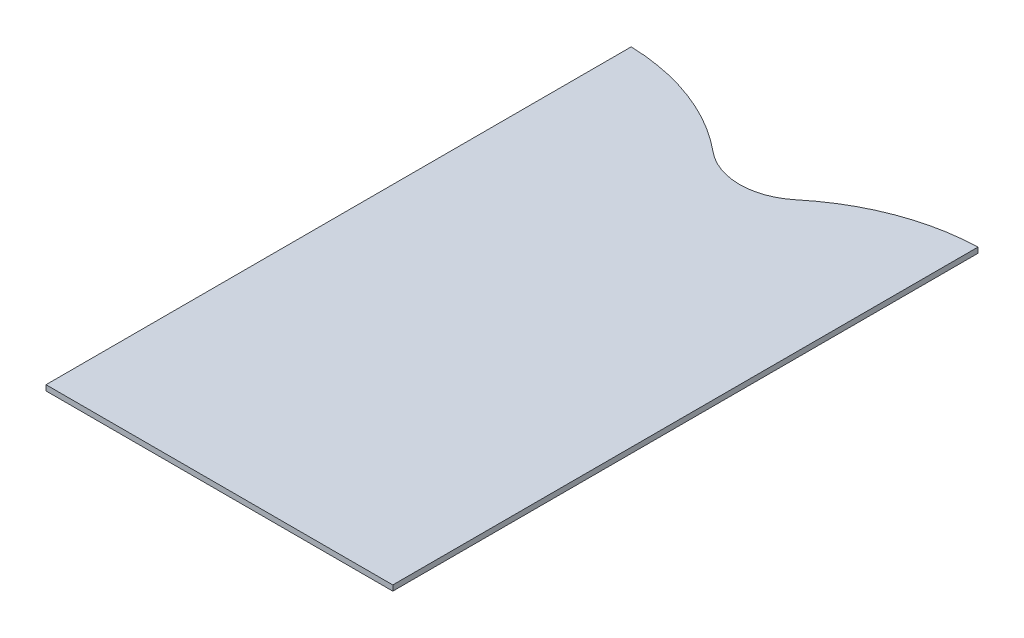
ISO-10303-21;
HEADER;
FILE_DESCRIPTION(('STEP AP214'),'2;1');
FILE_NAME('part.step','',(''),(''),'','','');
FILE_SCHEMA(('AUTOMOTIVE_DESIGN { 1 0 10303 214 1 1 1 1 }'));
ENDSEC;
DATA;
#1=APPLICATION_CONTEXT('core data for automotive mechanical design processes');
#2=APPLICATION_PROTOCOL_DEFINITION('international standard','automotive_design',2000,#1);
#3=PRODUCT_CONTEXT('',#1,'mechanical');
#4=PRODUCT('Part','Part','',(#3));
#5=PRODUCT_RELATED_PRODUCT_CATEGORY('part','',(#4));
#6=PRODUCT_DEFINITION_FORMATION('','',#4);
#7=PRODUCT_DEFINITION_CONTEXT('part definition',#1,'design');
#8=PRODUCT_DEFINITION('design','',#6,#7);
#9=PRODUCT_DEFINITION_SHAPE('','',#8);
#10=(LENGTH_UNIT() NAMED_UNIT(*) SI_UNIT(.MILLI.,.METRE.));
#11=(NAMED_UNIT(*) PLANE_ANGLE_UNIT() SI_UNIT($,.RADIAN.));
#12=(NAMED_UNIT(*) SI_UNIT($,.STERADIAN.) SOLID_ANGLE_UNIT());
#13=UNCERTAINTY_MEASURE_WITH_UNIT(LENGTH_MEASURE(1.E-05),#10,'distance_accuracy_value','');
#14=(GEOMETRIC_REPRESENTATION_CONTEXT(3) GLOBAL_UNCERTAINTY_ASSIGNED_CONTEXT((#13)) GLOBAL_UNIT_ASSIGNED_CONTEXT((#10,
#11,#12)) REPRESENTATION_CONTEXT('',''));
#15=CARTESIAN_POINT('',(0.,0.,0.));
#16=DIRECTION('',(0.,0.,1.));
#17=DIRECTION('',(1.,0.,0.));
#18=AXIS2_PLACEMENT_3D('',#15,#16,#17);
#19=CARTESIAN_POINT('',(101.6,3.175,-171.45));
#20=DIRECTION('',(-1.,0.,0.));
#21=DIRECTION('',(0.,0.,1.));
#22=AXIS2_PLACEMENT_3D('',#19,#20,#21);
#23=PLANE('',#22);
#24=DIRECTION('',(0.,0.,-1.));
#25=VECTOR('',#24,1.);
#26=CARTESIAN_POINT('',(101.6,0.,-171.45));
#27=LINE('',#26,#25);
#28=CARTESIAN_POINT('',(101.6,0.,171.45));
#29=VERTEX_POINT('',#28);
#30=CARTESIAN_POINT('',(101.6,0.,-171.45));
#31=VERTEX_POINT('',#30);
#32=EDGE_CURVE('E122',#29,#31,#27,.T.);
#33=ORIENTED_EDGE('',*,*,#32,.T.);
#34=DIRECTION('',(0.,-1.,0.));
#35=VECTOR('',#34,1.);
#36=CARTESIAN_POINT('',(101.6,3.175,-171.45));
#37=LINE('',#36,#35);
#38=CARTESIAN_POINT('',(101.6,3.175,-171.45));
#39=VERTEX_POINT('',#38);
#40=EDGE_CURVE('E101',#39,#31,#37,.T.);
#41=ORIENTED_EDGE('',*,*,#40,.F.);
#42=DIRECTION('',(0.,0.,-1.));
#43=VECTOR('',#42,1.);
#44=CARTESIAN_POINT('',(101.6,3.175,-171.45));
#45=LINE('',#44,#43);
#46=CARTESIAN_POINT('',(101.6,3.175,171.45));
#47=VERTEX_POINT('',#46);
#48=EDGE_CURVE('E109',#47,#39,#45,.T.);
#49=ORIENTED_EDGE('',*,*,#48,.F.);
#50=DIRECTION('',(0.,-1.,0.));
#51=VECTOR('',#50,1.);
#52=CARTESIAN_POINT('',(101.6,3.175,171.45));
#53=LINE('',#52,#51);
#54=EDGE_CURVE('E153',#47,#29,#53,.T.);
#55=ORIENTED_EDGE('',*,*,#54,.T.);
#56=EDGE_LOOP('',(#33,#41,#49,#55));
#57=FACE_BOUND('',#56,.T.);
#58=ADVANCED_FACE('F43',(#57),#23,.F.);
#59=CARTESIAN_POINT('',(-101.6,3.175,-171.45));
#60=DIRECTION('',(1.,0.,0.));
#61=DIRECTION('',(0.,0.,-1.));
#62=AXIS2_PLACEMENT_3D('',#59,#60,#61);
#63=PLANE('',#62);
#64=DIRECTION('',(0.,0.,1.));
#65=VECTOR('',#64,1.);
#66=CARTESIAN_POINT('',(-101.6,0.,-171.45));
#67=LINE('',#66,#65);
#68=CARTESIAN_POINT('',(-101.6,0.,-171.45));
#69=VERTEX_POINT('',#68);
#70=CARTESIAN_POINT('',(-101.6,0.,171.45));
#71=VERTEX_POINT('',#70);
#72=EDGE_CURVE('E156',#69,#71,#67,.T.);
#73=ORIENTED_EDGE('',*,*,#72,.T.);
#74=DIRECTION('',(0.,-1.,0.));
#75=VECTOR('',#74,1.);
#76=CARTESIAN_POINT('',(-101.6,3.175,171.45));
#77=LINE('',#76,#75);
#78=CARTESIAN_POINT('',(-101.6,3.175,171.45));
#79=VERTEX_POINT('',#78);
#80=EDGE_CURVE('E129',#79,#71,#77,.T.);
#81=ORIENTED_EDGE('',*,*,#80,.F.);
#82=DIRECTION('',(0.,0.,1.));
#83=VECTOR('',#82,1.);
#84=CARTESIAN_POINT('',(-101.6,3.175,-171.45));
#85=LINE('',#84,#83);
#86=CARTESIAN_POINT('',(-101.6,3.175,-171.45));
#87=VERTEX_POINT('',#86);
#88=EDGE_CURVE('E117',#87,#79,#85,.T.);
#89=ORIENTED_EDGE('',*,*,#88,.F.);
#90=DIRECTION('',(0.,-1.,0.));
#91=VECTOR('',#90,1.);
#92=CARTESIAN_POINT('',(-101.6,3.175,-171.45));
#93=LINE('',#92,#91);
#94=EDGE_CURVE('E124',#87,#69,#93,.T.);
#95=ORIENTED_EDGE('',*,*,#94,.T.);
#96=EDGE_LOOP('',(#73,#81,#89,#95));
#97=FACE_BOUND('',#96,.T.);
#98=ADVANCED_FACE('F171',(#97),#63,.F.);
#99=CARTESIAN_POINT('',(-101.6,3.175,171.45));
#100=DIRECTION('',(0.,0.,-1.));
#101=DIRECTION('',(-1.,0.,0.));
#102=AXIS2_PLACEMENT_3D('',#99,#100,#101);
#103=PLANE('',#102);
#104=DIRECTION('',(1.,0.,0.));
#105=VECTOR('',#104,1.);
#106=CARTESIAN_POINT('',(-101.6,0.,171.45));
#107=LINE('',#106,#105);
#108=EDGE_CURVE('E118',#71,#29,#107,.T.);
#109=ORIENTED_EDGE('',*,*,#108,.T.);
#110=ORIENTED_EDGE('',*,*,#54,.F.);
#111=DIRECTION('',(1.,0.,0.));
#112=VECTOR('',#111,1.);
#113=CARTESIAN_POINT('',(-101.6,3.175,171.45));
#114=LINE('',#113,#112);
#115=EDGE_CURVE('E112',#79,#47,#114,.T.);
#116=ORIENTED_EDGE('',*,*,#115,.F.);
#117=ORIENTED_EDGE('',*,*,#80,.T.);
#118=EDGE_LOOP('',(#109,#110,#116,#117));
#119=FACE_BOUND('',#118,.T.);
#120=ADVANCED_FACE('F167',(#119),#103,.F.);
#121=CARTESIAN_POINT('',(0.,3.175,0.));
#122=DIRECTION('',(0.,1.,0.));
#123=DIRECTION('',(0.,0.,1.));
#124=AXIS2_PLACEMENT_3D('',#121,#122,#123);
#125=PLANE('',#124);
#126=ORIENTED_EDGE('',*,*,#48,.T.);
#127=CARTESIAN_POINT('',(105.56875,3.175,-44.5120268657266));
#128=DIRECTION('',(0.,1.,0.));
#129=DIRECTION('',(0.,0.,1.));
#130=AXIS2_PLACEMENT_3D('',#127,#128,#129);
#131=CIRCLE('',#130,127.);
#132=CARTESIAN_POINT('',(24.3620192307692,3.175,-142.156621584398));
#133=VERTEX_POINT('',#132);
#134=EDGE_CURVE('E96',#39,#133,#131,.T.);
#135=ORIENTED_EDGE('',*,*,#134,.T.);
#136=CARTESIAN_POINT('',(0.,3.175,-171.45));
#137=DIRECTION('',(0.,1.,0.));
#138=DIRECTION('',(0.,0.,1.));
#139=AXIS2_PLACEMENT_3D('',#136,#137,#138);
#140=CIRCLE('',#139,38.1);
#141=CARTESIAN_POINT('',(-24.3620192307693,3.175,-142.156621584398));
#142=VERTEX_POINT('',#141);
#143=EDGE_CURVE('E140',#142,#133,#140,.T.);
#144=ORIENTED_EDGE('',*,*,#143,.F.);
#145=CARTESIAN_POINT('',(-105.56875,3.175,-44.5120268657267));
#146=DIRECTION('',(0.,1.,0.));
#147=DIRECTION('',(0.,0.,1.));
#148=AXIS2_PLACEMENT_3D('',#145,#146,#147);
#149=CIRCLE('',#148,127.);
#150=EDGE_CURVE('E106',#142,#87,#149,.T.);
#151=ORIENTED_EDGE('',*,*,#150,.T.);
#152=ORIENTED_EDGE('',*,*,#88,.T.);
#153=ORIENTED_EDGE('',*,*,#115,.T.);
#154=EDGE_LOOP('',(#126,#135,#144,#151,#152,#153));
#155=FACE_BOUND('',#154,.T.);
#156=ADVANCED_FACE('F110',(#155),#125,.T.);
#157=CARTESIAN_POINT('',(0.,0.,0.));
#158=DIRECTION('',(0.,1.,0.));
#159=DIRECTION('',(0.,0.,1.));
#160=AXIS2_PLACEMENT_3D('',#157,#158,#159);
#161=PLANE('',#160);
#162=CARTESIAN_POINT('',(0.,0.,-171.45));
#163=DIRECTION('',(0.,1.,0.));
#164=DIRECTION('',(0.,0.,1.));
#165=AXIS2_PLACEMENT_3D('',#162,#163,#164);
#166=CIRCLE('',#165,38.1);
#167=CARTESIAN_POINT('',(-24.3620192307693,0.,-142.156621584398));
#168=VERTEX_POINT('',#167);
#169=CARTESIAN_POINT('',(24.3620192307692,0.,-142.156621584398));
#170=VERTEX_POINT('',#169);
#171=EDGE_CURVE('E141',#168,#170,#166,.T.);
#172=ORIENTED_EDGE('',*,*,#171,.T.);
#173=CARTESIAN_POINT('',(105.56875,0.,-44.5120268657266));
#174=DIRECTION('',(0.,1.,0.));
#175=DIRECTION('',(0.,0.,1.));
#176=AXIS2_PLACEMENT_3D('',#173,#174,#175);
#177=CIRCLE('',#176,127.);
#178=EDGE_CURVE('E11',#170,#31,#177,.F.);
#179=ORIENTED_EDGE('',*,*,#178,.T.);
#180=ORIENTED_EDGE('',*,*,#32,.F.);
#181=ORIENTED_EDGE('',*,*,#108,.F.);
#182=ORIENTED_EDGE('',*,*,#72,.F.);
#183=CARTESIAN_POINT('',(-105.56875,0.,-44.5120268657267));
#184=DIRECTION('',(0.,1.,0.));
#185=DIRECTION('',(0.,0.,1.));
#186=AXIS2_PLACEMENT_3D('',#183,#184,#185);
#187=CIRCLE('',#186,127.);
#188=EDGE_CURVE('E52',#69,#168,#187,.F.);
#189=ORIENTED_EDGE('',*,*,#188,.T.);
#190=EDGE_LOOP('',(#172,#179,#180,#181,#182,#189));
#191=FACE_BOUND('',#190,.T.);
#192=ADVANCED_FACE('F169',(#191),#161,.F.);
#193=CARTESIAN_POINT('',(0.,0.,-171.45));
#194=DIRECTION('',(0.,1.,0.));
#195=DIRECTION('',(0.,0.,1.));
#196=AXIS2_PLACEMENT_3D('',#193,#194,#195);
#197=CYLINDRICAL_SURFACE('',#196,38.1);
#198=ORIENTED_EDGE('',*,*,#143,.T.);
#199=DIRECTION('',(0.,1.,0.));
#200=VECTOR('',#199,1.);
#201=CARTESIAN_POINT('',(24.3620192307692,0.,-142.156621584398));
#202=LINE('',#201,#200);
#203=EDGE_CURVE('E59',#133,#170,#202,.F.);
#204=ORIENTED_EDGE('',*,*,#203,.T.);
#205=ORIENTED_EDGE('',*,*,#171,.F.);
#206=DIRECTION('',(0.,1.,0.));
#207=VECTOR('',#206,1.);
#208=CARTESIAN_POINT('',(-24.3620192307693,0.,-142.156621584398));
#209=LINE('',#208,#207);
#210=EDGE_CURVE('E105',#168,#142,#209,.T.);
#211=ORIENTED_EDGE('',*,*,#210,.T.);
#212=EDGE_LOOP('',(#198,#204,#205,#211));
#213=FACE_BOUND('',#212,.T.);
#214=ADVANCED_FACE('F139',(#213),#197,.F.);
#215=CARTESIAN_POINT('',(105.56875,0.,-44.5120268657266));
#216=DIRECTION('',(0.,1.,0.));
#217=DIRECTION('',(0.,0.,1.));
#218=AXIS2_PLACEMENT_3D('',#215,#216,#217);
#219=CYLINDRICAL_SURFACE('',#218,127.);
#220=ORIENTED_EDGE('',*,*,#178,.F.);
#221=ORIENTED_EDGE('',*,*,#203,.F.);
#222=ORIENTED_EDGE('',*,*,#134,.F.);
#223=ORIENTED_EDGE('',*,*,#40,.T.);
#224=EDGE_LOOP('',(#220,#221,#222,#223));
#225=FACE_BOUND('',#224,.T.);
#226=ADVANCED_FACE('F99',(#225),#219,.T.);
#227=CARTESIAN_POINT('',(-105.56875,3.175,-44.5120268657267));
#228=DIRECTION('',(0.,1.,0.));
#229=DIRECTION('',(0.,0.,1.));
#230=AXIS2_PLACEMENT_3D('',#227,#228,#229);
#231=CYLINDRICAL_SURFACE('',#230,127.);
#232=ORIENTED_EDGE('',*,*,#188,.F.);
#233=ORIENTED_EDGE('',*,*,#94,.F.);
#234=ORIENTED_EDGE('',*,*,#150,.F.);
#235=ORIENTED_EDGE('',*,*,#210,.F.);
#236=EDGE_LOOP('',(#232,#233,#234,#235));
#237=FACE_BOUND('',#236,.T.);
#238=ADVANCED_FACE('F45',(#237),#231,.T.);
#239=CLOSED_SHELL('',(#58,#98,#120,#156,#192,#214,#226,#238));
#240=MANIFOLD_SOLID_BREP('B2',#239);
#241=ADVANCED_BREP_SHAPE_REPRESENTATION('',(#18,#240),#14);
#242=SHAPE_DEFINITION_REPRESENTATION(#9,#241);
ENDSEC;
END-ISO-10303-21;
